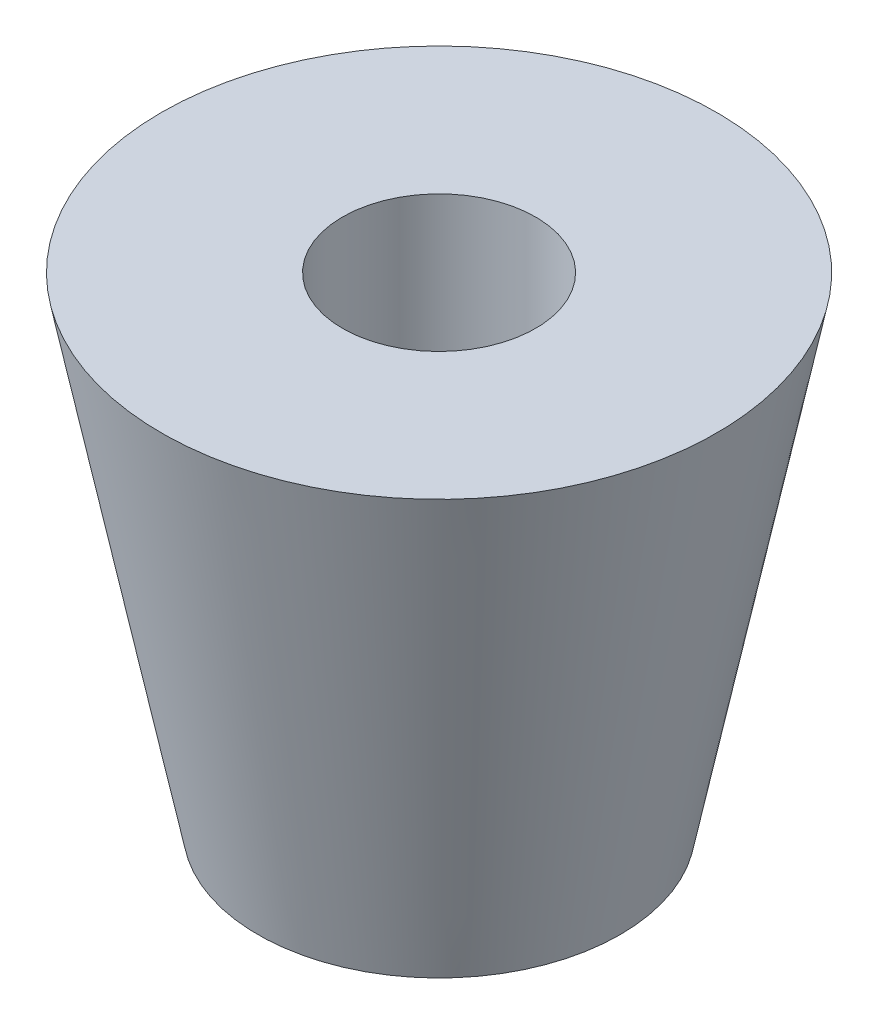
ISO-10303-21;
HEADER;
FILE_DESCRIPTION(('STEP AP214'),'2;1');
FILE_NAME('part.step','',(''),(''),'','','');
FILE_SCHEMA(('AUTOMOTIVE_DESIGN { 1 0 10303 214 1 1 1 1 }'));
ENDSEC;
DATA;
#1=APPLICATION_CONTEXT('core data for automotive mechanical design processes');
#2=APPLICATION_PROTOCOL_DEFINITION('international standard','automotive_design',2000,#1);
#3=PRODUCT_CONTEXT('',#1,'mechanical');
#4=PRODUCT('Part','Part','',(#3));
#5=PRODUCT_RELATED_PRODUCT_CATEGORY('part','',(#4));
#6=PRODUCT_DEFINITION_FORMATION('','',#4);
#7=PRODUCT_DEFINITION_CONTEXT('part definition',#1,'design');
#8=PRODUCT_DEFINITION('design','',#6,#7);
#9=PRODUCT_DEFINITION_SHAPE('','',#8);
#10=(LENGTH_UNIT() NAMED_UNIT(*) SI_UNIT(.MILLI.,.METRE.));
#11=(NAMED_UNIT(*) PLANE_ANGLE_UNIT() SI_UNIT($,.RADIAN.));
#12=(NAMED_UNIT(*) SI_UNIT($,.STERADIAN.) SOLID_ANGLE_UNIT());
#13=UNCERTAINTY_MEASURE_WITH_UNIT(LENGTH_MEASURE(1.E-05),#10,'distance_accuracy_value','');
#14=(GEOMETRIC_REPRESENTATION_CONTEXT(3) GLOBAL_UNCERTAINTY_ASSIGNED_CONTEXT((#13)) GLOBAL_UNIT_ASSIGNED_CONTEXT((#10,
#11,#12)) REPRESENTATION_CONTEXT('',''));
#15=CARTESIAN_POINT('',(0.,0.,0.));
#16=DIRECTION('',(0.,0.,1.));
#17=DIRECTION('',(1.,0.,0.));
#18=AXIS2_PLACEMENT_3D('',#15,#16,#17);
#19=CARTESIAN_POINT('',(0.,0.,0.));
#20=DIRECTION('',(0.,-1.,0.));
#21=DIRECTION('',(1.,0.,0.));
#22=AXIS2_PLACEMENT_3D('',#19,#20,#21);
#23=PLANE('',#22);
#24=CARTESIAN_POINT('',(0.,0.,0.));
#25=DIRECTION('',(0.,1.,0.));
#26=DIRECTION('',(-1.,0.,0.));
#27=AXIS2_PLACEMENT_3D('',#24,#25,#26);
#28=CIRCLE('',#27,4.);
#29=CARTESIAN_POINT('',(-4.,0.,0.));
#30=VERTEX_POINT('',#29);
#31=EDGE_CURVE('E54',#30,#30,#28,.T.);
#32=ORIENTED_EDGE('',*,*,#31,.F.);
#33=EDGE_LOOP('',(#32));
#34=FACE_BOUND('',#33,.T.);
#35=CARTESIAN_POINT('',(0.,0.,0.));
#36=DIRECTION('',(0.,1.,0.));
#37=DIRECTION('',(-1.,0.,0.));
#38=AXIS2_PLACEMENT_3D('',#35,#36,#37);
#39=CIRCLE('',#38,11.5);
#40=CARTESIAN_POINT('',(-11.5,0.,0.));
#41=VERTEX_POINT('',#40);
#42=EDGE_CURVE('E10',#41,#41,#39,.T.);
#43=ORIENTED_EDGE('',*,*,#42,.T.);
#44=EDGE_LOOP('',(#43));
#45=FACE_BOUND('',#44,.T.);
#46=ADVANCED_FACE('F37',(#34,#45),#23,.F.);
#47=CARTESIAN_POINT('',(0.,-20.,0.));
#48=DIRECTION('',(0.,1.,0.));
#49=DIRECTION('',(-1.,0.,0.));
#50=AXIS2_PLACEMENT_3D('',#47,#48,#49);
#51=CONICAL_SURFACE('',#50,7.5,0.197395559849881);
#52=ORIENTED_EDGE('',*,*,#42,.F.);
#53=EDGE_LOOP('',(#52));
#54=FACE_BOUND('',#53,.T.);
#55=CARTESIAN_POINT('',(0.,-20.,0.));
#56=DIRECTION('',(0.,1.,0.));
#57=DIRECTION('',(-1.,0.,0.));
#58=AXIS2_PLACEMENT_3D('',#55,#56,#57);
#59=CIRCLE('',#58,7.5);
#60=CARTESIAN_POINT('',(-7.49999999999999,-20.,0.));
#61=VERTEX_POINT('',#60);
#62=EDGE_CURVE('E44',#61,#61,#59,.T.);
#63=ORIENTED_EDGE('',*,*,#62,.T.);
#64=EDGE_LOOP('',(#63));
#65=FACE_BOUND('',#64,.T.);
#66=ADVANCED_FACE('F64',(#54,#65),#51,.T.);
#67=CARTESIAN_POINT('',(7.5,-20.,0.));
#68=DIRECTION('',(0.,1.,0.));
#69=DIRECTION('',(-1.,0.,0.));
#70=AXIS2_PLACEMENT_3D('',#67,#68,#69);
#71=PLANE('',#70);
#72=CARTESIAN_POINT('',(0.,-20.,0.));
#73=DIRECTION('',(0.,1.,0.));
#74=DIRECTION('',(-1.,0.,0.));
#75=AXIS2_PLACEMENT_3D('',#72,#73,#74);
#76=CIRCLE('',#75,4.);
#77=CARTESIAN_POINT('',(-3.99999999999999,-20.,0.));
#78=VERTEX_POINT('',#77);
#79=EDGE_CURVE('E49',#78,#78,#76,.T.);
#80=ORIENTED_EDGE('',*,*,#79,.T.);
#81=EDGE_LOOP('',(#80));
#82=FACE_BOUND('',#81,.T.);
#83=ORIENTED_EDGE('',*,*,#62,.F.);
#84=EDGE_LOOP('',(#83));
#85=FACE_BOUND('',#84,.T.);
#86=ADVANCED_FACE('F68',(#82,#85),#71,.F.);
#87=CARTESIAN_POINT('',(0.,-20.,0.));
#88=DIRECTION('',(0.,1.,0.));
#89=DIRECTION('',(-1.,0.,0.));
#90=AXIS2_PLACEMENT_3D('',#87,#88,#89);
#91=CYLINDRICAL_SURFACE('',#90,4.);
#92=ORIENTED_EDGE('',*,*,#79,.F.);
#93=EDGE_LOOP('',(#92));
#94=FACE_BOUND('',#93,.T.);
#95=ORIENTED_EDGE('',*,*,#31,.T.);
#96=EDGE_LOOP('',(#95));
#97=FACE_BOUND('',#96,.T.);
#98=ADVANCED_FACE('F61',(#94,#97),#91,.F.);
#99=CLOSED_SHELL('',(#46,#66,#86,#98));
#100=MANIFOLD_SOLID_BREP('B2',#99);
#101=ADVANCED_BREP_SHAPE_REPRESENTATION('',(#18,#100),#14);
#102=SHAPE_DEFINITION_REPRESENTATION(#9,#101);
ENDSEC;
END-ISO-10303-21;
